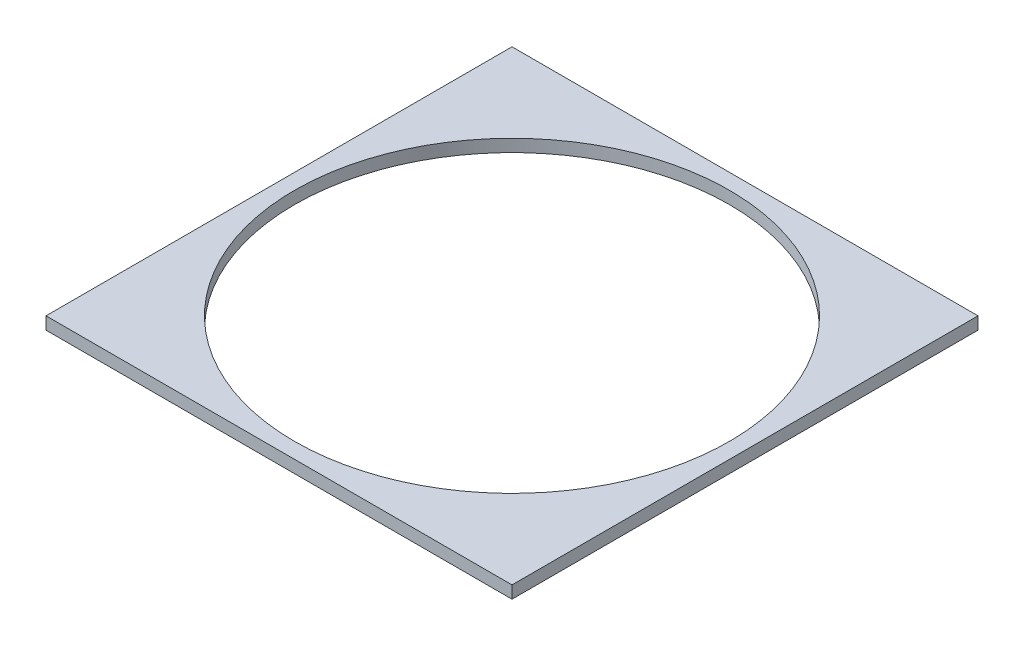
ISO-10303-21;
HEADER;
FILE_DESCRIPTION(('STEP AP214'),'2;1');
FILE_NAME('part.step','',(''),(''),'','','');
FILE_SCHEMA(('AUTOMOTIVE_DESIGN { 1 0 10303 214 1 1 1 1 }'));
ENDSEC;
DATA;
#1=APPLICATION_CONTEXT('core data for automotive mechanical design processes');
#2=APPLICATION_PROTOCOL_DEFINITION('international standard','automotive_design',2000,#1);
#3=PRODUCT_CONTEXT('',#1,'mechanical');
#4=PRODUCT('Part','Part','',(#3));
#5=PRODUCT_RELATED_PRODUCT_CATEGORY('part','',(#4));
#6=PRODUCT_DEFINITION_FORMATION('','',#4);
#7=PRODUCT_DEFINITION_CONTEXT('part definition',#1,'design');
#8=PRODUCT_DEFINITION('design','',#6,#7);
#9=PRODUCT_DEFINITION_SHAPE('','',#8);
#10=(LENGTH_UNIT() NAMED_UNIT(*) SI_UNIT(.MILLI.,.METRE.));
#11=(NAMED_UNIT(*) PLANE_ANGLE_UNIT() SI_UNIT($,.RADIAN.));
#12=(NAMED_UNIT(*) SI_UNIT($,.STERADIAN.) SOLID_ANGLE_UNIT());
#13=UNCERTAINTY_MEASURE_WITH_UNIT(LENGTH_MEASURE(1.E-05),#10,'distance_accuracy_value','');
#14=(GEOMETRIC_REPRESENTATION_CONTEXT(3) GLOBAL_UNCERTAINTY_ASSIGNED_CONTEXT((#13)) GLOBAL_UNIT_ASSIGNED_CONTEXT((#10,
#11,#12)) REPRESENTATION_CONTEXT('',''));
#15=CARTESIAN_POINT('',(0.,0.,0.));
#16=DIRECTION('',(0.,0.,1.));
#17=DIRECTION('',(1.,0.,0.));
#18=AXIS2_PLACEMENT_3D('',#15,#16,#17);
#19=CARTESIAN_POINT('',(150.,8.,150.));
#20=DIRECTION('',(-1.,0.,0.));
#21=DIRECTION('',(0.,0.,1.));
#22=AXIS2_PLACEMENT_3D('',#19,#20,#21);
#23=PLANE('',#22);
#24=DIRECTION('',(0.,0.,-1.));
#25=VECTOR('',#24,1.);
#26=CARTESIAN_POINT('',(150.,0.,150.));
#27=LINE('',#26,#25);
#28=CARTESIAN_POINT('',(150.,0.,150.));
#29=VERTEX_POINT('',#28);
#30=CARTESIAN_POINT('',(150.,0.,-150.));
#31=VERTEX_POINT('',#30);
#32=EDGE_CURVE('E98',#29,#31,#27,.T.);
#33=ORIENTED_EDGE('',*,*,#32,.T.);
#34=DIRECTION('',(0.,-1.,0.));
#35=VECTOR('',#34,1.);
#36=CARTESIAN_POINT('',(150.,8.,-150.));
#37=LINE('',#36,#35);
#38=CARTESIAN_POINT('',(150.,8.,-150.));
#39=VERTEX_POINT('',#38);
#40=EDGE_CURVE('E11',#39,#31,#37,.T.);
#41=ORIENTED_EDGE('',*,*,#40,.F.);
#42=DIRECTION('',(0.,0.,-1.));
#43=VECTOR('',#42,1.);
#44=CARTESIAN_POINT('',(150.,8.,150.));
#45=LINE('',#44,#43);
#46=CARTESIAN_POINT('',(150.,8.,150.));
#47=VERTEX_POINT('',#46);
#48=EDGE_CURVE('E85',#47,#39,#45,.T.);
#49=ORIENTED_EDGE('',*,*,#48,.F.);
#50=DIRECTION('',(0.,-1.,0.));
#51=VECTOR('',#50,1.);
#52=CARTESIAN_POINT('',(150.,8.,150.));
#53=LINE('',#52,#51);
#54=EDGE_CURVE('E94',#47,#29,#53,.T.);
#55=ORIENTED_EDGE('',*,*,#54,.T.);
#56=EDGE_LOOP('',(#33,#41,#49,#55));
#57=FACE_BOUND('',#56,.T.);
#58=ADVANCED_FACE('F33',(#57),#23,.F.);
#59=CARTESIAN_POINT('',(-150.,8.,-150.));
#60=DIRECTION('',(0.,0.,1.));
#61=DIRECTION('',(1.,0.,0.));
#62=AXIS2_PLACEMENT_3D('',#59,#60,#61);
#63=PLANE('',#62);
#64=DIRECTION('',(-1.,0.,0.));
#65=VECTOR('',#64,1.);
#66=CARTESIAN_POINT('',(-150.,0.,-150.));
#67=LINE('',#66,#65);
#68=CARTESIAN_POINT('',(-150.,0.,-150.));
#69=VERTEX_POINT('',#68);
#70=EDGE_CURVE('E89',#31,#69,#67,.T.);
#71=ORIENTED_EDGE('',*,*,#70,.T.);
#72=DIRECTION('',(0.,-1.,0.));
#73=VECTOR('',#72,1.);
#74=CARTESIAN_POINT('',(-150.,8.,-150.));
#75=LINE('',#74,#73);
#76=CARTESIAN_POINT('',(-150.,8.,-150.));
#77=VERTEX_POINT('',#76);
#78=EDGE_CURVE('E42',#77,#69,#75,.T.);
#79=ORIENTED_EDGE('',*,*,#78,.F.);
#80=DIRECTION('',(-1.,0.,0.));
#81=VECTOR('',#80,1.);
#82=CARTESIAN_POINT('',(-150.,8.,-150.));
#83=LINE('',#82,#81);
#84=EDGE_CURVE('E80',#39,#77,#83,.T.);
#85=ORIENTED_EDGE('',*,*,#84,.F.);
#86=ORIENTED_EDGE('',*,*,#40,.T.);
#87=EDGE_LOOP('',(#71,#79,#85,#86));
#88=FACE_BOUND('',#87,.T.);
#89=ADVANCED_FACE('F88',(#88),#63,.F.);
#90=CARTESIAN_POINT('',(-150.,8.,150.));
#91=DIRECTION('',(1.,0.,0.));
#92=DIRECTION('',(0.,0.,-1.));
#93=AXIS2_PLACEMENT_3D('',#90,#91,#92);
#94=PLANE('',#93);
#95=DIRECTION('',(0.,0.,1.));
#96=VECTOR('',#95,1.);
#97=CARTESIAN_POINT('',(-150.,0.,150.));
#98=LINE('',#97,#96);
#99=CARTESIAN_POINT('',(-150.,0.,150.));
#100=VERTEX_POINT('',#99);
#101=EDGE_CURVE('E67',#69,#100,#98,.T.);
#102=ORIENTED_EDGE('',*,*,#101,.T.);
#103=DIRECTION('',(0.,-1.,0.));
#104=VECTOR('',#103,1.);
#105=CARTESIAN_POINT('',(-150.,8.,150.));
#106=LINE('',#105,#104);
#107=CARTESIAN_POINT('',(-150.,8.,150.));
#108=VERTEX_POINT('',#107);
#109=EDGE_CURVE('E90',#108,#100,#106,.T.);
#110=ORIENTED_EDGE('',*,*,#109,.F.);
#111=DIRECTION('',(0.,0.,1.));
#112=VECTOR('',#111,1.);
#113=CARTESIAN_POINT('',(-150.,8.,150.));
#114=LINE('',#113,#112);
#115=EDGE_CURVE('E83',#77,#108,#114,.T.);
#116=ORIENTED_EDGE('',*,*,#115,.F.);
#117=ORIENTED_EDGE('',*,*,#78,.T.);
#118=EDGE_LOOP('',(#102,#110,#116,#117));
#119=FACE_BOUND('',#118,.T.);
#120=ADVANCED_FACE('F92',(#119),#94,.F.);
#121=CARTESIAN_POINT('',(-150.,8.,150.));
#122=DIRECTION('',(0.,0.,-1.));
#123=DIRECTION('',(-1.,0.,0.));
#124=AXIS2_PLACEMENT_3D('',#121,#122,#123);
#125=PLANE('',#124);
#126=DIRECTION('',(1.,0.,0.));
#127=VECTOR('',#126,1.);
#128=CARTESIAN_POINT('',(-150.,0.,150.));
#129=LINE('',#128,#127);
#130=EDGE_CURVE('E73',#100,#29,#129,.T.);
#131=ORIENTED_EDGE('',*,*,#130,.T.);
#132=ORIENTED_EDGE('',*,*,#54,.F.);
#133=DIRECTION('',(1.,0.,0.));
#134=VECTOR('',#133,1.);
#135=CARTESIAN_POINT('',(-150.,8.,150.));
#136=LINE('',#135,#134);
#137=EDGE_CURVE('E50',#108,#47,#136,.T.);
#138=ORIENTED_EDGE('',*,*,#137,.F.);
#139=ORIENTED_EDGE('',*,*,#109,.T.);
#140=EDGE_LOOP('',(#131,#132,#138,#139));
#141=FACE_BOUND('',#140,.T.);
#142=ADVANCED_FACE('F105',(#141),#125,.F.);
#143=CARTESIAN_POINT('',(0.,8.,0.));
#144=DIRECTION('',(0.,-1.,0.));
#145=DIRECTION('',(0.,0.,-1.));
#146=AXIS2_PLACEMENT_3D('',#143,#144,#145);
#147=PLANE('',#146);
#148=CARTESIAN_POINT('',(0.,8.,0.));
#149=DIRECTION('',(0.,1.,0.));
#150=DIRECTION('',(0.,0.,1.));
#151=AXIS2_PLACEMENT_3D('',#148,#149,#150);
#152=CIRCLE('',#151,140.);
#153=CARTESIAN_POINT('',(0.,8.,140.));
#154=VERTEX_POINT('',#153);
#155=EDGE_CURVE('E111',#154,#154,#152,.T.);
#156=ORIENTED_EDGE('',*,*,#155,.F.);
#157=EDGE_LOOP('',(#156));
#158=FACE_BOUND('',#157,.T.);
#159=ORIENTED_EDGE('',*,*,#48,.T.);
#160=ORIENTED_EDGE('',*,*,#84,.T.);
#161=ORIENTED_EDGE('',*,*,#115,.T.);
#162=ORIENTED_EDGE('',*,*,#137,.T.);
#163=EDGE_LOOP('',(#159,#160,#161,#162));
#164=FACE_BOUND('',#163,.T.);
#165=ADVANCED_FACE('F81',(#158,#164),#147,.F.);
#166=CARTESIAN_POINT('',(0.,0.,0.));
#167=DIRECTION('',(0.,-1.,0.));
#168=DIRECTION('',(0.,0.,-1.));
#169=AXIS2_PLACEMENT_3D('',#166,#167,#168);
#170=PLANE('',#169);
#171=CARTESIAN_POINT('',(0.,0.,0.));
#172=DIRECTION('',(0.,-1.,0.));
#173=DIRECTION('',(0.,0.,-1.));
#174=AXIS2_PLACEMENT_3D('',#171,#172,#173);
#175=CIRCLE('',#174,140.);
#176=CARTESIAN_POINT('',(0.,0.,-140.));
#177=VERTEX_POINT('',#176);
#178=EDGE_CURVE('E36',#177,#177,#175,.T.);
#179=ORIENTED_EDGE('',*,*,#178,.F.);
#180=EDGE_LOOP('',(#179));
#181=FACE_BOUND('',#180,.T.);
#182=ORIENTED_EDGE('',*,*,#32,.F.);
#183=ORIENTED_EDGE('',*,*,#130,.F.);
#184=ORIENTED_EDGE('',*,*,#101,.F.);
#185=ORIENTED_EDGE('',*,*,#70,.F.);
#186=EDGE_LOOP('',(#182,#183,#184,#185));
#187=FACE_BOUND('',#186,.T.);
#188=ADVANCED_FACE('F108',(#181,#187),#170,.T.);
#189=CARTESIAN_POINT('',(0.,-2.,0.));
#190=DIRECTION('',(0.,1.,0.));
#191=DIRECTION('',(0.,0.,1.));
#192=AXIS2_PLACEMENT_3D('',#189,#190,#191);
#193=CYLINDRICAL_SURFACE('',#192,140.);
#194=ORIENTED_EDGE('',*,*,#178,.T.);
#195=EDGE_LOOP('',(#194));
#196=FACE_BOUND('',#195,.T.);
#197=ORIENTED_EDGE('',*,*,#155,.T.);
#198=EDGE_LOOP('',(#197));
#199=FACE_BOUND('',#198,.T.);
#200=ADVANCED_FACE('F118',(#196,#199),#193,.F.);
#201=CLOSED_SHELL('',(#58,#89,#120,#142,#165,#188,#200));
#202=MANIFOLD_SOLID_BREP('B2',#201);
#203=ADVANCED_BREP_SHAPE_REPRESENTATION('',(#18,#202),#14);
#204=SHAPE_DEFINITION_REPRESENTATION(#9,#203);
ENDSEC;
END-ISO-10303-21;
